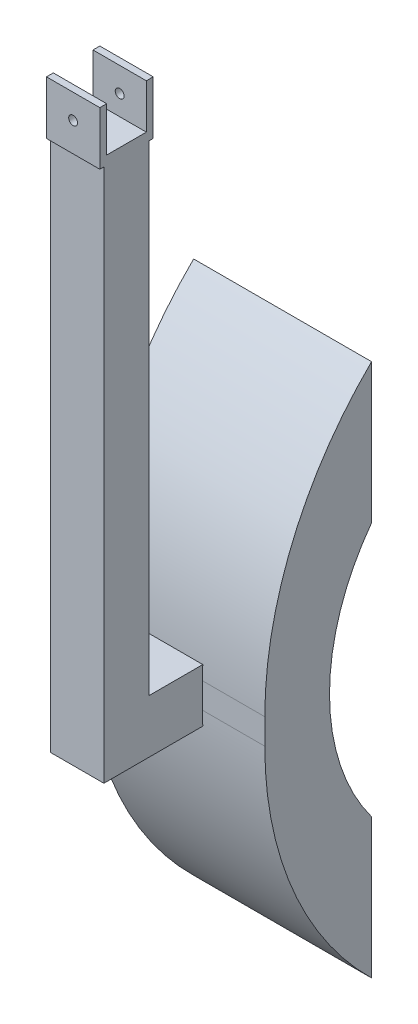
ISO-10303-21;
HEADER;
FILE_DESCRIPTION(('STEP AP214'),'2;1');
FILE_NAME('part.step','',(''),(''),'','','');
FILE_SCHEMA(('AUTOMOTIVE_DESIGN { 1 0 10303 214 1 1 1 1 }'));
ENDSEC;
DATA;
#1=APPLICATION_CONTEXT('core data for automotive mechanical design processes');
#2=APPLICATION_PROTOCOL_DEFINITION('international standard','automotive_design',2000,#1);
#3=PRODUCT_CONTEXT('',#1,'mechanical');
#4=PRODUCT('Part','Part','',(#3));
#5=PRODUCT_RELATED_PRODUCT_CATEGORY('part','',(#4));
#6=PRODUCT_DEFINITION_FORMATION('','',#4);
#7=PRODUCT_DEFINITION_CONTEXT('part definition',#1,'design');
#8=PRODUCT_DEFINITION('design','',#6,#7);
#9=PRODUCT_DEFINITION_SHAPE('','',#8);
#10=(LENGTH_UNIT() NAMED_UNIT(*) SI_UNIT(.MILLI.,.METRE.));
#11=(NAMED_UNIT(*) PLANE_ANGLE_UNIT() SI_UNIT($,.RADIAN.));
#12=(NAMED_UNIT(*) SI_UNIT($,.STERADIAN.) SOLID_ANGLE_UNIT());
#13=UNCERTAINTY_MEASURE_WITH_UNIT(LENGTH_MEASURE(1.E-05),#10,'distance_accuracy_value','');
#14=(GEOMETRIC_REPRESENTATION_CONTEXT(3) GLOBAL_UNCERTAINTY_ASSIGNED_CONTEXT((#13)) GLOBAL_UNIT_ASSIGNED_CONTEXT((#10,
#11,#12)) REPRESENTATION_CONTEXT('',''));
#15=CARTESIAN_POINT('',(0.,0.,0.));
#16=DIRECTION('',(0.,0.,1.));
#17=DIRECTION('',(1.,0.,0.));
#18=AXIS2_PLACEMENT_3D('',#15,#16,#17);
#19=CARTESIAN_POINT('',(0.,0.,-102.72));
#20=DIRECTION('',(0.,0.,-1.));
#21=DIRECTION('',(-1.,0.,0.));
#22=AXIS2_PLACEMENT_3D('',#19,#20,#21);
#23=PLANE('',#22);
#24=DIRECTION('',(0.,-1.,0.));
#25=VECTOR('',#24,1.);
#26=CARTESIAN_POINT('',(50.,-137.5,-102.72));
#27=LINE('',#26,#25);
#28=CARTESIAN_POINT('',(50.,-137.5,-102.72));
#29=VERTEX_POINT('',#28);
#30=CARTESIAN_POINT('',(50.,-215.998843293269,-102.72));
#31=VERTEX_POINT('',#30);
#32=EDGE_CURVE('E202',#29,#31,#27,.T.);
#33=ORIENTED_EDGE('',*,*,#32,.T.);
#34=DIRECTION('',(-1.,0.,0.));
#35=VECTOR('',#34,1.);
#36=CARTESIAN_POINT('',(662.478313901807,-215.998843293269,-102.72));
#37=LINE('',#36,#35);
#38=CARTESIAN_POINT('',(-50.,-215.998843293269,-102.72));
#39=VERTEX_POINT('',#38);
#40=EDGE_CURVE('E58',#31,#39,#37,.T.);
#41=ORIENTED_EDGE('',*,*,#40,.T.);
#42=DIRECTION('',(0.,1.,0.));
#43=VECTOR('',#42,1.);
#44=CARTESIAN_POINT('',(-50.,-137.5,-102.72));
#45=LINE('',#44,#43);
#46=CARTESIAN_POINT('',(-50.,-137.5,-102.72));
#47=VERTEX_POINT('',#46);
#48=EDGE_CURVE('E217',#39,#47,#45,.T.);
#49=ORIENTED_EDGE('',*,*,#48,.T.);
#50=DIRECTION('',(1.,0.,0.));
#51=VECTOR('',#50,1.);
#52=CARTESIAN_POINT('',(50.,-137.5,-102.72));
#53=LINE('',#52,#51);
#54=EDGE_CURVE('E203',#47,#29,#53,.T.);
#55=ORIENTED_EDGE('',*,*,#54,.T.);
#56=EDGE_LOOP('',(#33,#41,#49,#55));
#57=FACE_BOUND('',#56,.T.);
#58=ADVANCED_FACE('F43',(#57),#23,.T.);
#59=CARTESIAN_POINT('',(0.,0.,-42.72));
#60=DIRECTION('',(0.,0.,-1.));
#61=DIRECTION('',(-1.,0.,0.));
#62=AXIS2_PLACEMENT_3D('',#59,#60,#61);
#63=PLANE('',#62);
#64=DIRECTION('',(0.,-1.,0.));
#65=VECTOR('',#64,1.);
#66=CARTESIAN_POINT('',(50.,-137.5,-42.72));
#67=LINE('',#66,#65);
#68=CARTESIAN_POINT('',(50.,-280.328568570857,-42.72));
#69=VERTEX_POINT('',#68);
#70=CARTESIAN_POINT('',(50.,-294.671431429143,-42.72));
#71=VERTEX_POINT('',#70);
#72=EDGE_CURVE('E225',#69,#71,#67,.T.);
#73=ORIENTED_EDGE('',*,*,#72,.F.);
#74=DIRECTION('',(1.,0.,0.));
#75=VECTOR('',#74,1.);
#76=CARTESIAN_POINT('',(0.,-280.328568570857,-42.72));
#77=LINE('',#76,#75);
#78=CARTESIAN_POINT('',(15.,-280.328568570857,-42.72));
#79=VERTEX_POINT('',#78);
#80=EDGE_CURVE('E364',#69,#79,#77,.F.);
#81=ORIENTED_EDGE('',*,*,#80,.T.);
#82=DIRECTION('',(0.,-1.,0.));
#83=VECTOR('',#82,1.);
#84=CARTESIAN_POINT('',(15.,-302.5,-42.72));
#85=LINE('',#84,#83);
#86=CARTESIAN_POINT('',(15.,-294.671431429143,-42.72));
#87=VERTEX_POINT('',#86);
#88=EDGE_CURVE('E227',#79,#87,#85,.T.);
#89=ORIENTED_EDGE('',*,*,#88,.T.);
#90=DIRECTION('',(-1.,0.,0.));
#91=VECTOR('',#90,1.);
#92=CARTESIAN_POINT('',(0.,-294.671431429143,-42.72));
#93=LINE('',#92,#91);
#94=EDGE_CURVE('E345',#87,#71,#93,.F.);
#95=ORIENTED_EDGE('',*,*,#94,.T.);
#96=EDGE_LOOP('',(#73,#81,#89,#95));
#97=FACE_BOUND('',#96,.T.);
#98=ADVANCED_FACE('F448',(#97),#63,.F.);
#99=CARTESIAN_POINT('',(-15.,-302.5,-12.72));
#100=DIRECTION('',(0.,0.,1.));
#101=DIRECTION('',(1.,0.,0.));
#102=AXIS2_PLACEMENT_3D('',#99,#100,#101);
#103=PLANE('',#102);
#104=DIRECTION('',(1.,0.,0.));
#105=VECTOR('',#104,1.);
#106=CARTESIAN_POINT('',(15.,-272.5,-12.72));
#107=LINE('',#106,#105);
#108=CARTESIAN_POINT('',(-15.,-272.5,-12.72));
#109=VERTEX_POINT('',#108);
#110=CARTESIAN_POINT('',(15.,-272.5,-12.72));
#111=VERTEX_POINT('',#110);
#112=EDGE_CURVE('E222',#109,#111,#107,.T.);
#113=ORIENTED_EDGE('',*,*,#112,.F.);
#114=DIRECTION('',(0.,1.,0.));
#115=VECTOR('',#114,1.);
#116=CARTESIAN_POINT('',(-15.,-302.5,-12.72));
#117=LINE('',#116,#115);
#118=CARTESIAN_POINT('',(-15.,-2.5,-12.72));
#119=VERTEX_POINT('',#118);
#120=EDGE_CURVE('E253',#109,#119,#117,.T.);
#121=ORIENTED_EDGE('',*,*,#120,.T.);
#122=DIRECTION('',(1.,0.,0.));
#123=VECTOR('',#122,1.);
#124=CARTESIAN_POINT('',(-15.,-2.5,-12.72));
#125=LINE('',#124,#123);
#126=CARTESIAN_POINT('',(15.,-2.5,-12.72));
#127=VERTEX_POINT('',#126);
#128=EDGE_CURVE('E243',#119,#127,#125,.T.);
#129=ORIENTED_EDGE('',*,*,#128,.T.);
#130=DIRECTION('',(0.,1.,0.));
#131=VECTOR('',#130,1.);
#132=CARTESIAN_POINT('',(15.,-302.5,-12.72));
#133=LINE('',#132,#131);
#134=EDGE_CURVE('E247',#111,#127,#133,.T.);
#135=ORIENTED_EDGE('',*,*,#134,.F.);
#136=EDGE_LOOP('',(#113,#121,#129,#135));
#137=FACE_BOUND('',#136,.T.);
#138=ADVANCED_FACE('F441',(#137),#103,.F.);
#139=CARTESIAN_POINT('',(0.,-2.5,0.));
#140=DIRECTION('',(0.,1.,0.));
#141=DIRECTION('',(0.,0.,1.));
#142=AXIS2_PLACEMENT_3D('',#139,#140,#141);
#143=PLANE('',#142);
#144=ORIENTED_EDGE('',*,*,#128,.F.);
#145=DIRECTION('',(0.,0.,1.));
#146=VECTOR('',#145,1.);
#147=CARTESIAN_POINT('',(-15.,-2.5,-11.1535));
#148=LINE('',#147,#146);
#149=CARTESIAN_POINT('',(-15.,-2.5,-15.));
#150=VERTEX_POINT('',#149);
#151=EDGE_CURVE('E328',#150,#119,#148,.T.);
#152=ORIENTED_EDGE('',*,*,#151,.F.);
#153=DIRECTION('',(1.,0.,0.));
#154=VECTOR('',#153,1.);
#155=CARTESIAN_POINT('',(0.,-2.5,-15.));
#156=LINE('',#155,#154);
#157=CARTESIAN_POINT('',(15.,-2.5,-15.));
#158=VERTEX_POINT('',#157);
#159=EDGE_CURVE('E273',#150,#158,#156,.T.);
#160=ORIENTED_EDGE('',*,*,#159,.T.);
#161=DIRECTION('',(0.,0.,-1.));
#162=VECTOR('',#161,1.);
#163=CARTESIAN_POINT('',(15.,-2.5,-11.1535));
#164=LINE('',#163,#162);
#165=EDGE_CURVE('E323',#127,#158,#164,.T.);
#166=ORIENTED_EDGE('',*,*,#165,.F.);
#167=EDGE_LOOP('',(#144,#152,#160,#166));
#168=FACE_BOUND('',#167,.T.);
#169=ADVANCED_FACE('F437',(#168),#143,.F.);
#170=DIRECTION('',(-1.,0.,0.));
#171=VECTOR('',#170,1.);
#172=CARTESIAN_POINT('',(-15.,-2.5,12.72));
#173=LINE('',#172,#171);
#174=CARTESIAN_POINT('',(15.,-2.5,12.72));
#175=VERTEX_POINT('',#174);
#176=CARTESIAN_POINT('',(-15.,-2.5,12.72));
#177=VERTEX_POINT('',#176);
#178=EDGE_CURVE('E238',#175,#177,#173,.T.);
#179=ORIENTED_EDGE('',*,*,#178,.F.);
#180=CARTESIAN_POINT('',(15.,-2.5,15.));
#181=VERTEX_POINT('',#180);
#182=EDGE_CURVE('E338',#181,#175,#164,.T.);
#183=ORIENTED_EDGE('',*,*,#182,.F.);
#184=DIRECTION('',(1.,0.,0.));
#185=VECTOR('',#184,1.);
#186=CARTESIAN_POINT('',(0.,-2.5,15.));
#187=LINE('',#186,#185);
#188=CARTESIAN_POINT('',(-15.,-2.5,15.));
#189=VERTEX_POINT('',#188);
#190=EDGE_CURVE('E298',#189,#181,#187,.T.);
#191=ORIENTED_EDGE('',*,*,#190,.F.);
#192=EDGE_CURVE('E341',#177,#189,#148,.T.);
#193=ORIENTED_EDGE('',*,*,#192,.F.);
#194=EDGE_LOOP('',(#179,#183,#191,#193));
#195=FACE_BOUND('',#194,.T.);
#196=ADVANCED_FACE('F403',(#195),#143,.F.);
#197=CARTESIAN_POINT('',(15.,2.5,-11.1535));
#198=DIRECTION('',(-1.,0.,0.));
#199=DIRECTION('',(0.,0.,1.));
#200=AXIS2_PLACEMENT_3D('',#197,#198,#199);
#201=PLANE('',#200);
#202=ORIENTED_EDGE('',*,*,#182,.T.);
#203=DIRECTION('',(0.,1.,0.));
#204=VECTOR('',#203,1.);
#205=CARTESIAN_POINT('',(15.,-302.5,12.72));
#206=LINE('',#205,#204);
#207=CARTESIAN_POINT('',(15.,-302.5,12.72));
#208=VERTEX_POINT('',#207);
#209=EDGE_CURVE('E258',#208,#175,#206,.T.);
#210=ORIENTED_EDGE('',*,*,#209,.F.);
#211=DIRECTION('',(0.,0.,1.));
#212=VECTOR('',#211,1.);
#213=CARTESIAN_POINT('',(15.,-302.5,12.72));
#214=LINE('',#213,#212);
#215=CARTESIAN_POINT('',(15.,-302.5,-42.8732749476955));
#216=VERTEX_POINT('',#215);
#217=EDGE_CURVE('E239',#216,#208,#214,.T.);
#218=ORIENTED_EDGE('',*,*,#217,.F.);
#219=CARTESIAN_POINT('',(15.,-294.671431429143,-242.72));
#220=DIRECTION('',(-1.,0.,0.));
#221=DIRECTION('',(0.,0.,1.));
#222=AXIS2_PLACEMENT_3D('',#219,#220,#221);
#223=CIRCLE('',#222,200.);
#224=EDGE_CURVE('E357',#216,#87,#223,.T.);
#225=ORIENTED_EDGE('',*,*,#224,.T.);
#226=ORIENTED_EDGE('',*,*,#88,.F.);
#227=CARTESIAN_POINT('',(15.,-280.328568570857,-242.72));
#228=DIRECTION('',(-1.,0.,0.));
#229=DIRECTION('',(0.,0.,1.));
#230=AXIS2_PLACEMENT_3D('',#227,#228,#229);
#231=CIRCLE('',#230,200.);
#232=CARTESIAN_POINT('',(15.,-272.5,-42.8732749476955));
#233=VERTEX_POINT('',#232);
#234=EDGE_CURVE('E369',#79,#233,#231,.T.);
#235=ORIENTED_EDGE('',*,*,#234,.T.);
#236=DIRECTION('',(0.,0.,1.));
#237=VECTOR('',#236,1.);
#238=CARTESIAN_POINT('',(15.,-272.5,-42.72));
#239=LINE('',#238,#237);
#240=EDGE_CURVE('E232',#233,#111,#239,.T.);
#241=ORIENTED_EDGE('',*,*,#240,.T.);
#242=ORIENTED_EDGE('',*,*,#134,.T.);
#243=ORIENTED_EDGE('',*,*,#165,.T.);
#244=DIRECTION('',(0.,-1.,0.));
#245=VECTOR('',#244,1.);
#246=CARTESIAN_POINT('',(15.,27.5,-15.));
#247=LINE('',#246,#245);
#248=CARTESIAN_POINT('',(15.,27.5,-15.));
#249=VERTEX_POINT('',#248);
#250=EDGE_CURVE('E290',#249,#158,#247,.T.);
#251=ORIENTED_EDGE('',*,*,#250,.F.);
#252=DIRECTION('',(0.,0.,1.));
#253=VECTOR('',#252,1.);
#254=CARTESIAN_POINT('',(15.,27.5,0.));
#255=LINE('',#254,#253);
#256=CARTESIAN_POINT('',(15.,27.5,-11.1535));
#257=VERTEX_POINT('',#256);
#258=EDGE_CURVE('E279',#249,#257,#255,.T.);
#259=ORIENTED_EDGE('',*,*,#258,.T.);
#260=DIRECTION('',(0.,-1.,0.));
#261=VECTOR('',#260,1.);
#262=CARTESIAN_POINT('',(15.,27.5,-11.1535));
#263=LINE('',#262,#261);
#264=CARTESIAN_POINT('',(15.,2.5,-11.1535));
#265=VERTEX_POINT('',#264);
#266=EDGE_CURVE('E293',#257,#265,#263,.T.);
#267=ORIENTED_EDGE('',*,*,#266,.T.);
#268=DIRECTION('',(0.,0.,-1.));
#269=VECTOR('',#268,1.);
#270=CARTESIAN_POINT('',(15.,2.5,-11.1535));
#271=LINE('',#270,#269);
#272=CARTESIAN_POINT('',(15.,2.5,11.1535));
#273=VERTEX_POINT('',#272);
#274=EDGE_CURVE('E324',#273,#265,#271,.T.);
#275=ORIENTED_EDGE('',*,*,#274,.F.);
#276=DIRECTION('',(0.,-1.,0.));
#277=VECTOR('',#276,1.);
#278=CARTESIAN_POINT('',(15.,27.5,11.1535));
#279=LINE('',#278,#277);
#280=CARTESIAN_POINT('',(15.,27.5,11.1535));
#281=VERTEX_POINT('',#280);
#282=EDGE_CURVE('E315',#281,#273,#279,.T.);
#283=ORIENTED_EDGE('',*,*,#282,.F.);
#284=DIRECTION('',(0.,0.,1.));
#285=VECTOR('',#284,1.);
#286=CARTESIAN_POINT('',(15.,27.5,0.));
#287=LINE('',#286,#285);
#288=CARTESIAN_POINT('',(15.,27.5,15.));
#289=VERTEX_POINT('',#288);
#290=EDGE_CURVE('E304',#281,#289,#287,.T.);
#291=ORIENTED_EDGE('',*,*,#290,.T.);
#292=DIRECTION('',(0.,-1.,0.));
#293=VECTOR('',#292,1.);
#294=CARTESIAN_POINT('',(15.,27.5,15.));
#295=LINE('',#294,#293);
#296=EDGE_CURVE('E317',#289,#181,#295,.T.);
#297=ORIENTED_EDGE('',*,*,#296,.T.);
#298=EDGE_LOOP('',(#202,#210,#218,#225,#226,#235,#241,#242,#243,#251,#259,#267,#275,#283,#291,#297));
#299=FACE_BOUND('',#298,.T.);
#300=ADVANCED_FACE('F406',(#299),#201,.F.);
#301=CARTESIAN_POINT('',(-15.,2.5,-11.1535));
#302=DIRECTION('',(1.,0.,0.));
#303=DIRECTION('',(0.,0.,-1.));
#304=AXIS2_PLACEMENT_3D('',#301,#302,#303);
#305=PLANE('',#304);
#306=ORIENTED_EDGE('',*,*,#151,.T.);
#307=ORIENTED_EDGE('',*,*,#120,.F.);
#308=DIRECTION('',(0.,0.,1.));
#309=VECTOR('',#308,1.);
#310=CARTESIAN_POINT('',(-15.,-272.5,-42.72));
#311=LINE('',#310,#309);
#312=CARTESIAN_POINT('',(-15.,-272.5,-42.8732749476955));
#313=VERTEX_POINT('',#312);
#314=EDGE_CURVE('E236',#313,#109,#311,.T.);
#315=ORIENTED_EDGE('',*,*,#314,.F.);
#316=CARTESIAN_POINT('',(-15.,-280.328568570857,-242.72));
#317=DIRECTION('',(1.,0.,0.));
#318=DIRECTION('',(0.,0.,-1.));
#319=AXIS2_PLACEMENT_3D('',#316,#317,#318);
#320=CIRCLE('',#319,200.);
#321=CARTESIAN_POINT('',(-15.,-280.328568570857,-42.72));
#322=VERTEX_POINT('',#321);
#323=EDGE_CURVE('E51',#313,#322,#320,.T.);
#324=ORIENTED_EDGE('',*,*,#323,.T.);
#325=DIRECTION('',(0.,1.,0.));
#326=VECTOR('',#325,1.);
#327=CARTESIAN_POINT('',(-15.,-302.5,-42.72));
#328=LINE('',#327,#326);
#329=CARTESIAN_POINT('',(-15.,-294.671431429143,-42.72));
#330=VERTEX_POINT('',#329);
#331=EDGE_CURVE('E229',#330,#322,#328,.T.);
#332=ORIENTED_EDGE('',*,*,#331,.F.);
#333=CARTESIAN_POINT('',(-15.,-294.671431429143,-242.72));
#334=DIRECTION('',(1.,0.,0.));
#335=DIRECTION('',(0.,0.,-1.));
#336=AXIS2_PLACEMENT_3D('',#333,#334,#335);
#337=CIRCLE('',#336,200.);
#338=CARTESIAN_POINT('',(-15.,-302.5,-42.8732749476955));
#339=VERTEX_POINT('',#338);
#340=EDGE_CURVE('E351',#330,#339,#337,.T.);
#341=ORIENTED_EDGE('',*,*,#340,.T.);
#342=DIRECTION('',(0.,0.,-1.));
#343=VECTOR('',#342,1.);
#344=CARTESIAN_POINT('',(-15.,-302.5,12.72));
#345=LINE('',#344,#343);
#346=CARTESIAN_POINT('',(-15.,-302.5,12.72));
#347=VERTEX_POINT('',#346);
#348=EDGE_CURVE('E245',#347,#339,#345,.T.);
#349=ORIENTED_EDGE('',*,*,#348,.F.);
#350=DIRECTION('',(0.,1.,0.));
#351=VECTOR('',#350,1.);
#352=CARTESIAN_POINT('',(-15.,-302.5,12.72));
#353=LINE('',#352,#351);
#354=EDGE_CURVE('E255',#347,#177,#353,.T.);
#355=ORIENTED_EDGE('',*,*,#354,.T.);
#356=ORIENTED_EDGE('',*,*,#192,.T.);
#357=DIRECTION('',(0.,-1.,0.));
#358=VECTOR('',#357,1.);
#359=CARTESIAN_POINT('',(-15.,27.5,15.));
#360=LINE('',#359,#358);
#361=CARTESIAN_POINT('',(-15.,27.5,15.));
#362=VERTEX_POINT('',#361);
#363=EDGE_CURVE('E320',#362,#189,#360,.T.);
#364=ORIENTED_EDGE('',*,*,#363,.F.);
#365=DIRECTION('',(0.,0.,1.));
#366=VECTOR('',#365,1.);
#367=CARTESIAN_POINT('',(-15.,27.5,0.));
#368=LINE('',#367,#366);
#369=CARTESIAN_POINT('',(-15.,27.5,11.1535));
#370=VERTEX_POINT('',#369);
#371=EDGE_CURVE('E299',#370,#362,#368,.T.);
#372=ORIENTED_EDGE('',*,*,#371,.F.);
#373=DIRECTION('',(0.,-1.,0.));
#374=VECTOR('',#373,1.);
#375=CARTESIAN_POINT('',(-15.,27.5,11.1535));
#376=LINE('',#375,#374);
#377=CARTESIAN_POINT('',(-15.,2.5,11.1535));
#378=VERTEX_POINT('',#377);
#379=EDGE_CURVE('E310',#370,#378,#376,.T.);
#380=ORIENTED_EDGE('',*,*,#379,.T.);
#381=DIRECTION('',(0.,0.,1.));
#382=VECTOR('',#381,1.);
#383=CARTESIAN_POINT('',(-15.,2.5,-11.1535));
#384=LINE('',#383,#382);
#385=CARTESIAN_POINT('',(-15.,2.5,-11.1535));
#386=VERTEX_POINT('',#385);
#387=EDGE_CURVE('E331',#386,#378,#384,.T.);
#388=ORIENTED_EDGE('',*,*,#387,.F.);
#389=DIRECTION('',(0.,-1.,0.));
#390=VECTOR('',#389,1.);
#391=CARTESIAN_POINT('',(-15.,27.5,-11.1535));
#392=LINE('',#391,#390);
#393=CARTESIAN_POINT('',(-15.,27.5,-11.1535));
#394=VERTEX_POINT('',#393);
#395=EDGE_CURVE('E296',#394,#386,#392,.T.);
#396=ORIENTED_EDGE('',*,*,#395,.F.);
#397=DIRECTION('',(0.,0.,1.));
#398=VECTOR('',#397,1.);
#399=CARTESIAN_POINT('',(-15.,27.5,0.));
#400=LINE('',#399,#398);
#401=CARTESIAN_POINT('',(-15.,27.5,-15.));
#402=VERTEX_POINT('',#401);
#403=EDGE_CURVE('E274',#402,#394,#400,.T.);
#404=ORIENTED_EDGE('',*,*,#403,.F.);
#405=DIRECTION('',(0.,-1.,0.));
#406=VECTOR('',#405,1.);
#407=CARTESIAN_POINT('',(-15.,27.5,-15.));
#408=LINE('',#407,#406);
#409=EDGE_CURVE('E285',#402,#150,#408,.T.);
#410=ORIENTED_EDGE('',*,*,#409,.T.);
#411=EDGE_LOOP('',(#306,#307,#315,#324,#332,#341,#349,#355,#356,#364,#372,#380,#388,#396,#404,#410));
#412=FACE_BOUND('',#411,.T.);
#413=ADVANCED_FACE('F377',(#412),#305,.F.);
#414=CARTESIAN_POINT('',(0.,2.5,0.));
#415=DIRECTION('',(0.,1.,0.));
#416=DIRECTION('',(0.,0.,1.));
#417=AXIS2_PLACEMENT_3D('',#414,#415,#416);
#418=PLANE('',#417);
#419=ORIENTED_EDGE('',*,*,#274,.T.);
#420=DIRECTION('',(-1.,0.,0.));
#421=VECTOR('',#420,1.);
#422=CARTESIAN_POINT('',(-15.,2.5,-11.1535));
#423=LINE('',#422,#421);
#424=EDGE_CURVE('E327',#265,#386,#423,.T.);
#425=ORIENTED_EDGE('',*,*,#424,.T.);
#426=ORIENTED_EDGE('',*,*,#387,.T.);
#427=DIRECTION('',(1.,0.,0.));
#428=VECTOR('',#427,1.);
#429=CARTESIAN_POINT('',(-15.,2.5,11.1535));
#430=LINE('',#429,#428);
#431=EDGE_CURVE('E334',#378,#273,#430,.T.);
#432=ORIENTED_EDGE('',*,*,#431,.T.);
#433=EDGE_LOOP('',(#419,#425,#426,#432));
#434=FACE_BOUND('',#433,.T.);
#435=ADVANCED_FACE('F421',(#434),#418,.T.);
#436=CARTESIAN_POINT('',(0.,27.5,11.1535));
#437=DIRECTION('',(0.,0.,-1.));
#438=DIRECTION('',(-1.,0.,0.));
#439=AXIS2_PLACEMENT_3D('',#436,#437,#438);
#440=PLANE('',#439);
#441=CARTESIAN_POINT('',(0.,13.784,11.1535));
#442=DIRECTION('',(0.,0.,-1.));
#443=DIRECTION('',(-1.,0.,0.));
#444=AXIS2_PLACEMENT_3D('',#441,#442,#443);
#445=CIRCLE('',#444,2.5);
#446=CARTESIAN_POINT('',(-2.5,13.784,11.1535));
#447=VERTEX_POINT('',#446);
#448=EDGE_CURVE('E270',#447,#447,#445,.T.);
#449=ORIENTED_EDGE('',*,*,#448,.F.);
#450=EDGE_LOOP('',(#449));
#451=FACE_BOUND('',#450,.T.);
#452=ORIENTED_EDGE('',*,*,#431,.F.);
#453=ORIENTED_EDGE('',*,*,#379,.F.);
#454=DIRECTION('',(1.,0.,0.));
#455=VECTOR('',#454,1.);
#456=CARTESIAN_POINT('',(0.,27.5,11.1535));
#457=LINE('',#456,#455);
#458=EDGE_CURVE('E307',#370,#281,#457,.T.);
#459=ORIENTED_EDGE('',*,*,#458,.T.);
#460=ORIENTED_EDGE('',*,*,#282,.T.);
#461=EDGE_LOOP('',(#452,#453,#459,#460));
#462=FACE_BOUND('',#461,.T.);
#463=ADVANCED_FACE('F418',(#451,#462),#440,.T.);
#464=CARTESIAN_POINT('',(0.,27.5,15.));
#465=DIRECTION('',(0.,0.,-1.));
#466=DIRECTION('',(-1.,0.,0.));
#467=AXIS2_PLACEMENT_3D('',#464,#465,#466);
#468=PLANE('',#467);
#469=CARTESIAN_POINT('',(0.,13.784,15.));
#470=DIRECTION('',(0.,0.,1.));
#471=DIRECTION('',(1.,0.,0.));
#472=AXIS2_PLACEMENT_3D('',#469,#470,#471);
#473=CIRCLE('',#472,2.5);
#474=CARTESIAN_POINT('',(2.5,13.784,15.));
#475=VERTEX_POINT('',#474);
#476=EDGE_CURVE('E261',#475,#475,#473,.T.);
#477=ORIENTED_EDGE('',*,*,#476,.F.);
#478=EDGE_LOOP('',(#477));
#479=FACE_BOUND('',#478,.T.);
#480=ORIENTED_EDGE('',*,*,#190,.T.);
#481=ORIENTED_EDGE('',*,*,#296,.F.);
#482=DIRECTION('',(1.,0.,0.));
#483=VECTOR('',#482,1.);
#484=CARTESIAN_POINT('',(0.,27.5,15.));
#485=LINE('',#484,#483);
#486=EDGE_CURVE('E302',#362,#289,#485,.T.);
#487=ORIENTED_EDGE('',*,*,#486,.F.);
#488=ORIENTED_EDGE('',*,*,#363,.T.);
#489=EDGE_LOOP('',(#480,#481,#487,#488));
#490=FACE_BOUND('',#489,.T.);
#491=ADVANCED_FACE('F410',(#479,#490),#468,.F.);
#492=CARTESIAN_POINT('',(0.,27.5,0.));
#493=DIRECTION('',(0.,1.,0.));
#494=DIRECTION('',(0.,0.,1.));
#495=AXIS2_PLACEMENT_3D('',#492,#493,#494);
#496=PLANE('',#495);
#497=ORIENTED_EDGE('',*,*,#371,.T.);
#498=ORIENTED_EDGE('',*,*,#486,.T.);
#499=ORIENTED_EDGE('',*,*,#290,.F.);
#500=ORIENTED_EDGE('',*,*,#458,.F.);
#501=EDGE_LOOP('',(#497,#498,#499,#500));
#502=FACE_BOUND('',#501,.T.);
#503=ADVANCED_FACE('F416',(#502),#496,.T.);
#504=CARTESIAN_POINT('',(0.,27.5,-11.1535));
#505=DIRECTION('',(0.,0.,1.));
#506=DIRECTION('',(1.,0.,0.));
#507=AXIS2_PLACEMENT_3D('',#504,#505,#506);
#508=PLANE('',#507);
#509=CARTESIAN_POINT('',(0.,13.784,-11.1535));
#510=DIRECTION('',(0.,0.,1.));
#511=DIRECTION('',(1.,0.,0.));
#512=AXIS2_PLACEMENT_3D('',#509,#510,#511);
#513=CIRCLE('',#512,2.5);
#514=CARTESIAN_POINT('',(2.5,13.784,-11.1535));
#515=VERTEX_POINT('',#514);
#516=EDGE_CURVE('E265',#515,#515,#513,.T.);
#517=ORIENTED_EDGE('',*,*,#516,.F.);
#518=EDGE_LOOP('',(#517));
#519=FACE_BOUND('',#518,.T.);
#520=ORIENTED_EDGE('',*,*,#424,.F.);
#521=ORIENTED_EDGE('',*,*,#266,.F.);
#522=DIRECTION('',(-1.,0.,0.));
#523=VECTOR('',#522,1.);
#524=CARTESIAN_POINT('',(0.,27.5,-11.1535));
#525=LINE('',#524,#523);
#526=EDGE_CURVE('E276',#257,#394,#525,.T.);
#527=ORIENTED_EDGE('',*,*,#526,.T.);
#528=ORIENTED_EDGE('',*,*,#395,.T.);
#529=EDGE_LOOP('',(#520,#521,#527,#528));
#530=FACE_BOUND('',#529,.T.);
#531=ADVANCED_FACE('F425',(#519,#530),#508,.T.);
#532=CARTESIAN_POINT('',(0.,27.5,-15.));
#533=DIRECTION('',(0.,0.,-1.));
#534=DIRECTION('',(-1.,0.,0.));
#535=AXIS2_PLACEMENT_3D('',#532,#533,#534);
#536=PLANE('',#535);
#537=CARTESIAN_POINT('',(0.,13.784,-15.));
#538=DIRECTION('',(0.,0.,1.));
#539=DIRECTION('',(1.,0.,0.));
#540=AXIS2_PLACEMENT_3D('',#537,#538,#539);
#541=CIRCLE('',#540,2.5);
#542=CARTESIAN_POINT('',(2.5,13.784,-15.));
#543=VERTEX_POINT('',#542);
#544=EDGE_CURVE('E262',#543,#543,#541,.T.);
#545=ORIENTED_EDGE('',*,*,#544,.T.);
#546=EDGE_LOOP('',(#545));
#547=FACE_BOUND('',#546,.T.);
#548=ORIENTED_EDGE('',*,*,#159,.F.);
#549=ORIENTED_EDGE('',*,*,#409,.F.);
#550=DIRECTION('',(1.,0.,0.));
#551=VECTOR('',#550,1.);
#552=CARTESIAN_POINT('',(0.,27.5,-15.));
#553=LINE('',#552,#551);
#554=EDGE_CURVE('E282',#402,#249,#553,.T.);
#555=ORIENTED_EDGE('',*,*,#554,.T.);
#556=ORIENTED_EDGE('',*,*,#250,.T.);
#557=EDGE_LOOP('',(#548,#549,#555,#556));
#558=FACE_BOUND('',#557,.T.);
#559=ADVANCED_FACE('F433',(#547,#558),#536,.T.);
#560=CARTESIAN_POINT('',(0.,27.5,0.));
#561=DIRECTION('',(0.,-1.,0.));
#562=DIRECTION('',(0.,0.,-1.));
#563=AXIS2_PLACEMENT_3D('',#560,#561,#562);
#564=PLANE('',#563);
#565=ORIENTED_EDGE('',*,*,#403,.T.);
#566=ORIENTED_EDGE('',*,*,#526,.F.);
#567=ORIENTED_EDGE('',*,*,#258,.F.);
#568=ORIENTED_EDGE('',*,*,#554,.F.);
#569=EDGE_LOOP('',(#565,#566,#567,#568));
#570=FACE_BOUND('',#569,.T.);
#571=ADVANCED_FACE('F427',(#570),#564,.F.);
#572=CARTESIAN_POINT('',(0.,13.784,-15.));
#573=DIRECTION('',(0.,0.,1.));
#574=DIRECTION('',(1.,0.,0.));
#575=AXIS2_PLACEMENT_3D('',#572,#573,#574);
#576=CYLINDRICAL_SURFACE('',#575,2.5);
#577=ORIENTED_EDGE('',*,*,#516,.T.);
#578=EDGE_LOOP('',(#577));
#579=FACE_BOUND('',#578,.T.);
#580=ORIENTED_EDGE('',*,*,#544,.F.);
#581=EDGE_LOOP('',(#580));
#582=FACE_BOUND('',#581,.T.);
#583=ADVANCED_FACE('F479',(#579,#582),#576,.F.);
#584=ORIENTED_EDGE('',*,*,#448,.T.);
#585=EDGE_LOOP('',(#584));
#586=FACE_BOUND('',#585,.T.);
#587=ORIENTED_EDGE('',*,*,#476,.T.);
#588=EDGE_LOOP('',(#587));
#589=FACE_BOUND('',#588,.T.);
#590=ADVANCED_FACE('F478',(#586,#589),#576,.F.);
#591=CARTESIAN_POINT('',(-15.,-302.5,12.72));
#592=DIRECTION('',(0.,0.,-1.));
#593=DIRECTION('',(-1.,0.,0.));
#594=AXIS2_PLACEMENT_3D('',#591,#592,#593);
#595=PLANE('',#594);
#596=ORIENTED_EDGE('',*,*,#178,.T.);
#597=ORIENTED_EDGE('',*,*,#354,.F.);
#598=DIRECTION('',(-1.,0.,0.));
#599=VECTOR('',#598,1.);
#600=CARTESIAN_POINT('',(-15.,-302.5,12.72));
#601=LINE('',#600,#599);
#602=EDGE_CURVE('E242',#208,#347,#601,.T.);
#603=ORIENTED_EDGE('',*,*,#602,.F.);
#604=ORIENTED_EDGE('',*,*,#209,.T.);
#605=EDGE_LOOP('',(#596,#597,#603,#604));
#606=FACE_BOUND('',#605,.T.);
#607=ADVANCED_FACE('F401',(#606),#595,.F.);
#608=CARTESIAN_POINT('',(0.,-302.5,0.));
#609=DIRECTION('',(0.,-1.,0.));
#610=DIRECTION('',(0.,0.,-1.));
#611=AXIS2_PLACEMENT_3D('',#608,#609,#610);
#612=PLANE('',#611);
#613=ORIENTED_EDGE('',*,*,#217,.T.);
#614=ORIENTED_EDGE('',*,*,#602,.T.);
#615=ORIENTED_EDGE('',*,*,#348,.T.);
#616=DIRECTION('',(-1.,0.,0.));
#617=VECTOR('',#616,1.);
#618=CARTESIAN_POINT('',(-15.,-302.5,-42.8732749476955));
#619=LINE('',#618,#617);
#620=EDGE_CURVE('E354',#339,#216,#619,.F.);
#621=ORIENTED_EDGE('',*,*,#620,.T.);
#622=EDGE_LOOP('',(#613,#614,#615,#621));
#623=FACE_BOUND('',#622,.T.);
#624=ADVANCED_FACE('F398',(#623),#612,.T.);
#625=CARTESIAN_POINT('',(15.,-272.5,-42.72));
#626=DIRECTION('',(0.,-1.,0.));
#627=DIRECTION('',(0.,0.,-1.));
#628=AXIS2_PLACEMENT_3D('',#625,#626,#627);
#629=PLANE('',#628);
#630=ORIENTED_EDGE('',*,*,#112,.T.);
#631=ORIENTED_EDGE('',*,*,#240,.F.);
#632=DIRECTION('',(1.,0.,0.));
#633=VECTOR('',#632,1.);
#634=CARTESIAN_POINT('',(15.,-272.5,-42.8732749476955));
#635=LINE('',#634,#633);
#636=EDGE_CURVE('E372',#233,#313,#635,.F.);
#637=ORIENTED_EDGE('',*,*,#636,.T.);
#638=ORIENTED_EDGE('',*,*,#314,.T.);
#639=EDGE_LOOP('',(#630,#631,#637,#638));
#640=FACE_BOUND('',#639,.T.);
#641=ADVANCED_FACE('F443',(#640),#629,.F.);
#642=ORIENTED_EDGE('',*,*,#331,.T.);
#643=DIRECTION('',(1.,0.,0.));
#644=VECTOR('',#643,1.);
#645=CARTESIAN_POINT('',(0.,-280.328568570857,-42.72));
#646=LINE('',#645,#644);
#647=CARTESIAN_POINT('',(-50.,-280.328568570857,-42.72));
#648=VERTEX_POINT('',#647);
#649=EDGE_CURVE('E362',#322,#648,#646,.F.);
#650=ORIENTED_EDGE('',*,*,#649,.T.);
#651=DIRECTION('',(0.,1.,0.));
#652=VECTOR('',#651,1.);
#653=CARTESIAN_POINT('',(-50.,-137.5,-42.72));
#654=LINE('',#653,#652);
#655=CARTESIAN_POINT('',(-50.,-294.671431429143,-42.72));
#656=VERTEX_POINT('',#655);
#657=EDGE_CURVE('E215',#656,#648,#654,.T.);
#658=ORIENTED_EDGE('',*,*,#657,.F.);
#659=DIRECTION('',(-1.,0.,0.));
#660=VECTOR('',#659,1.);
#661=CARTESIAN_POINT('',(0.,-294.671431429143,-42.72));
#662=LINE('',#661,#660);
#663=EDGE_CURVE('E348',#656,#330,#662,.F.);
#664=ORIENTED_EDGE('',*,*,#663,.T.);
#665=EDGE_LOOP('',(#642,#650,#658,#664));
#666=FACE_BOUND('',#665,.T.);
#667=ADVANCED_FACE('F384',(#666),#63,.F.);
#668=CARTESIAN_POINT('',(-50.,-137.5,-102.72));
#669=DIRECTION('',(1.,0.,0.));
#670=DIRECTION('',(0.,1.,0.));
#671=AXIS2_PLACEMENT_3D('',#668,#669,#670);
#672=PLANE('',#671);
#673=CARTESIAN_POINT('',(-50.,-287.5,-199.092115207665));
#674=DIRECTION('',(1.,0.,0.));
#675=DIRECTION('',(0.,1.,0.));
#676=AXIS2_PLACEMENT_3D('',#673,#674,#675);
#677=CIRCLE('',#676,120.);
#678=CARTESIAN_POINT('',(-50.0000000000001,-359.001156706731,-102.72));
#679=VERTEX_POINT('',#678);
#680=EDGE_CURVE('E65',#679,#39,#677,.F.);
#681=ORIENTED_EDGE('',*,*,#680,.F.);
#682=CARTESIAN_POINT('',(-50.,-437.5,-102.72));
#683=VERTEX_POINT('',#682);
#684=EDGE_CURVE('E208',#683,#679,#45,.T.);
#685=ORIENTED_EDGE('',*,*,#684,.F.);
#686=CARTESIAN_POINT('',(-50.,-294.671431429143,-242.72));
#687=DIRECTION('',(1.,0.,0.));
#688=DIRECTION('',(0.,1.,0.));
#689=AXIS2_PLACEMENT_3D('',#686,#687,#688);
#690=CIRCLE('',#689,200.);
#691=EDGE_CURVE('E337',#683,#656,#690,.F.);
#692=ORIENTED_EDGE('',*,*,#691,.T.);
#693=ORIENTED_EDGE('',*,*,#657,.T.);
#694=CARTESIAN_POINT('',(-50.,-280.328568570857,-242.72));
#695=DIRECTION('',(1.,0.,0.));
#696=DIRECTION('',(0.,1.,0.));
#697=AXIS2_PLACEMENT_3D('',#694,#695,#696);
#698=CIRCLE('',#697,200.);
#699=EDGE_CURVE('E366',#648,#47,#698,.F.);
#700=ORIENTED_EDGE('',*,*,#699,.T.);
#701=ORIENTED_EDGE('',*,*,#48,.F.);
#702=EDGE_LOOP('',(#681,#685,#692,#693,#700,#701));
#703=FACE_BOUND('',#702,.T.);
#704=ADVANCED_FACE('F390',(#703),#672,.F.);
#705=CARTESIAN_POINT('',(50.,-137.5,-102.72));
#706=DIRECTION('',(-1.,0.,0.));
#707=DIRECTION('',(0.,-1.,0.));
#708=AXIS2_PLACEMENT_3D('',#705,#706,#707);
#709=PLANE('',#708);
#710=CARTESIAN_POINT('',(50.,-287.5,-199.092115207665));
#711=DIRECTION('',(-1.,0.,0.));
#712=DIRECTION('',(0.,-1.,0.));
#713=AXIS2_PLACEMENT_3D('',#710,#711,#712);
#714=CIRCLE('',#713,120.);
#715=CARTESIAN_POINT('',(50.,-359.001156706731,-102.72));
#716=VERTEX_POINT('',#715);
#717=EDGE_CURVE('E11',#31,#716,#714,.F.);
#718=ORIENTED_EDGE('',*,*,#717,.F.);
#719=ORIENTED_EDGE('',*,*,#32,.F.);
#720=CARTESIAN_POINT('',(50.,-280.328568570857,-242.72));
#721=DIRECTION('',(-1.,0.,0.));
#722=DIRECTION('',(0.,-1.,0.));
#723=AXIS2_PLACEMENT_3D('',#720,#721,#722);
#724=CIRCLE('',#723,200.);
#725=EDGE_CURVE('E360',#29,#69,#724,.F.);
#726=ORIENTED_EDGE('',*,*,#725,.T.);
#727=ORIENTED_EDGE('',*,*,#72,.T.);
#728=CARTESIAN_POINT('',(50.,-294.671431429143,-242.72));
#729=DIRECTION('',(-1.,0.,0.));
#730=DIRECTION('',(0.,-1.,0.));
#731=AXIS2_PLACEMENT_3D('',#728,#729,#730);
#732=CIRCLE('',#731,200.);
#733=CARTESIAN_POINT('',(50.,-437.5,-102.72));
#734=VERTEX_POINT('',#733);
#735=EDGE_CURVE('E198',#71,#734,#732,.F.);
#736=ORIENTED_EDGE('',*,*,#735,.T.);
#737=EDGE_CURVE('E193',#716,#734,#27,.T.);
#738=ORIENTED_EDGE('',*,*,#737,.F.);
#739=EDGE_LOOP('',(#718,#719,#726,#727,#736,#738));
#740=FACE_BOUND('',#739,.T.);
#741=ADVANCED_FACE('F195',(#740),#709,.F.);
#742=DIRECTION('',(-1.,0.,0.));
#743=VECTOR('',#742,1.);
#744=CARTESIAN_POINT('',(662.478313901807,-359.001156706731,-102.72));
#745=LINE('',#744,#743);
#746=EDGE_CURVE('E206',#716,#679,#745,.T.);
#747=ORIENTED_EDGE('',*,*,#746,.F.);
#748=ORIENTED_EDGE('',*,*,#737,.T.);
#749=DIRECTION('',(-1.,0.,0.));
#750=VECTOR('',#749,1.);
#751=CARTESIAN_POINT('',(50.,-437.5,-102.72));
#752=LINE('',#751,#750);
#753=EDGE_CURVE('E220',#734,#683,#752,.T.);
#754=ORIENTED_EDGE('',*,*,#753,.T.);
#755=ORIENTED_EDGE('',*,*,#684,.T.);
#756=EDGE_LOOP('',(#747,#748,#754,#755));
#757=FACE_BOUND('',#756,.T.);
#758=ADVANCED_FACE('F207',(#757),#23,.T.);
#759=CARTESIAN_POINT('',(50.,-294.671431429143,-242.72));
#760=DIRECTION('',(-1.,0.,0.));
#761=DIRECTION('',(0.,0.,1.));
#762=AXIS2_PLACEMENT_3D('',#759,#760,#761);
#763=CYLINDRICAL_SURFACE('',#762,200.);
#764=ORIENTED_EDGE('',*,*,#340,.F.);
#765=ORIENTED_EDGE('',*,*,#663,.F.);
#766=ORIENTED_EDGE('',*,*,#691,.F.);
#767=ORIENTED_EDGE('',*,*,#753,.F.);
#768=ORIENTED_EDGE('',*,*,#735,.F.);
#769=ORIENTED_EDGE('',*,*,#94,.F.);
#770=ORIENTED_EDGE('',*,*,#224,.F.);
#771=ORIENTED_EDGE('',*,*,#620,.F.);
#772=EDGE_LOOP('',(#764,#765,#766,#767,#768,#769,#770,#771));
#773=FACE_BOUND('',#772,.T.);
#774=ADVANCED_FACE('F392',(#773),#763,.T.);
#775=CARTESIAN_POINT('',(50.,-280.328568570857,-242.72));
#776=DIRECTION('',(1.,0.,0.));
#777=DIRECTION('',(0.,0.,-1.));
#778=AXIS2_PLACEMENT_3D('',#775,#776,#777);
#779=CYLINDRICAL_SURFACE('',#778,200.);
#780=ORIENTED_EDGE('',*,*,#234,.F.);
#781=ORIENTED_EDGE('',*,*,#80,.F.);
#782=ORIENTED_EDGE('',*,*,#725,.F.);
#783=ORIENTED_EDGE('',*,*,#54,.F.);
#784=ORIENTED_EDGE('',*,*,#699,.F.);
#785=ORIENTED_EDGE('',*,*,#649,.F.);
#786=ORIENTED_EDGE('',*,*,#323,.F.);
#787=ORIENTED_EDGE('',*,*,#636,.F.);
#788=EDGE_LOOP('',(#780,#781,#782,#783,#784,#785,#786,#787));
#789=FACE_BOUND('',#788,.T.);
#790=ADVANCED_FACE('F45',(#789),#779,.T.);
#791=CARTESIAN_POINT('',(662.478313901807,-287.5,-199.092115207665));
#792=DIRECTION('',(-1.,0.,0.));
#793=DIRECTION('',(0.,-1.,0.));
#794=AXIS2_PLACEMENT_3D('',#791,#792,#793);
#795=CYLINDRICAL_SURFACE('',#794,120.);
#796=ORIENTED_EDGE('',*,*,#746,.T.);
#797=ORIENTED_EDGE('',*,*,#680,.T.);
#798=ORIENTED_EDGE('',*,*,#40,.F.);
#799=ORIENTED_EDGE('',*,*,#717,.T.);
#800=EDGE_LOOP('',(#796,#797,#798,#799));
#801=FACE_BOUND('',#800,.T.);
#802=ADVANCED_FACE('F211',(#801),#795,.F.);
#803=CLOSED_SHELL('',(#58,#98,#138,#169,#196,#300,#413,#435,#463,#491,#503,#531,#559,#571,#583,
#590,#607,#624,#641,#667,#704,#741,#758,#774,#790,#802));
#804=MANIFOLD_SOLID_BREP('B2',#803);
#805=ADVANCED_BREP_SHAPE_REPRESENTATION('',(#18,#804),#14);
#806=SHAPE_DEFINITION_REPRESENTATION(#9,#805);
ENDSEC;
END-ISO-10303-21;
